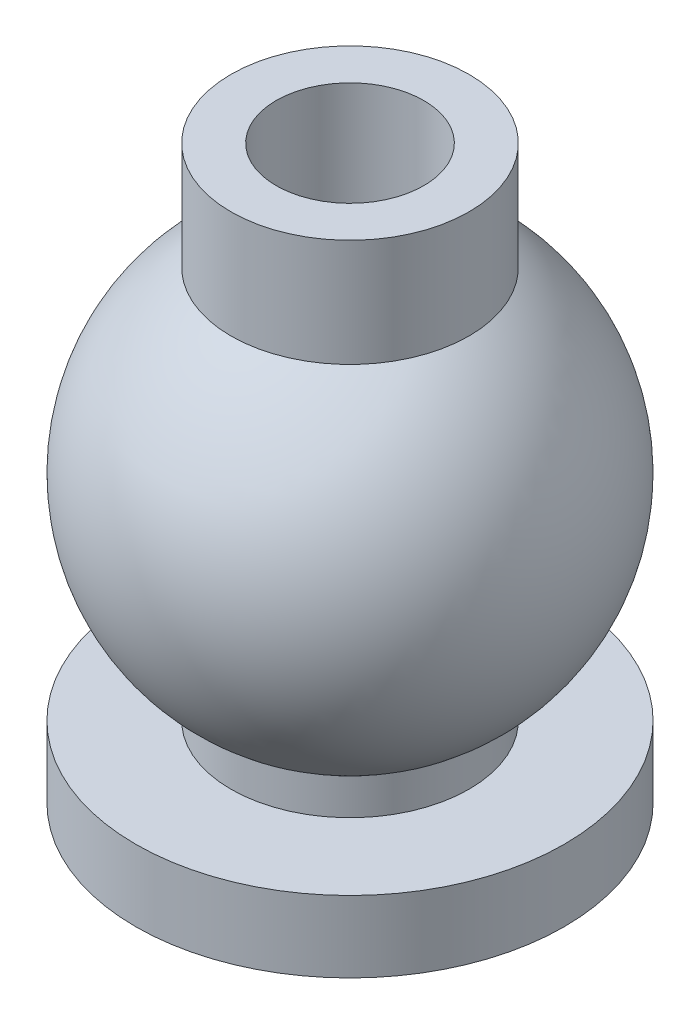
ISO-10303-21;
HEADER;
FILE_DESCRIPTION(('STEP AP214'),'2;1');
FILE_NAME('part.step','',(''),(''),'','','');
FILE_SCHEMA(('AUTOMOTIVE_DESIGN { 1 0 10303 214 1 1 1 1 }'));
ENDSEC;
DATA;
#1=APPLICATION_CONTEXT('core data for automotive mechanical design processes');
#2=APPLICATION_PROTOCOL_DEFINITION('international standard','automotive_design',2000,#1);
#3=PRODUCT_CONTEXT('',#1,'mechanical');
#4=PRODUCT('Part','Part','',(#3));
#5=PRODUCT_RELATED_PRODUCT_CATEGORY('part','',(#4));
#6=PRODUCT_DEFINITION_FORMATION('','',#4);
#7=PRODUCT_DEFINITION_CONTEXT('part definition',#1,'design');
#8=PRODUCT_DEFINITION('design','',#6,#7);
#9=PRODUCT_DEFINITION_SHAPE('','',#8);
#10=(LENGTH_UNIT() NAMED_UNIT(*) SI_UNIT(.MILLI.,.METRE.));
#11=(NAMED_UNIT(*) PLANE_ANGLE_UNIT() SI_UNIT($,.RADIAN.));
#12=(NAMED_UNIT(*) SI_UNIT($,.STERADIAN.) SOLID_ANGLE_UNIT());
#13=UNCERTAINTY_MEASURE_WITH_UNIT(LENGTH_MEASURE(1.E-05),#10,'distance_accuracy_value','');
#14=(GEOMETRIC_REPRESENTATION_CONTEXT(3) GLOBAL_UNCERTAINTY_ASSIGNED_CONTEXT((#13)) GLOBAL_UNIT_ASSIGNED_CONTEXT((#10,
#11,#12)) REPRESENTATION_CONTEXT('',''));
#15=CARTESIAN_POINT('',(0.,0.,0.));
#16=DIRECTION('',(0.,0.,1.));
#17=DIRECTION('',(1.,0.,0.));
#18=AXIS2_PLACEMENT_3D('',#15,#16,#17);
#19=CARTESIAN_POINT('',(0.,6.83647591011085,0.));
#20=DIRECTION('',(0.,1.,0.));
#21=DIRECTION('',(-1.,0.,0.));
#22=AXIS2_PLACEMENT_3D('',#19,#20,#21);
#23=CYLINDRICAL_SURFACE('',#22,1.55);
#24=CARTESIAN_POINT('',(0.,-6.,0.));
#25=DIRECTION('',(0.,1.,0.));
#26=DIRECTION('',(-1.,0.,0.));
#27=AXIS2_PLACEMENT_3D('',#24,#25,#26);
#28=CIRCLE('',#27,1.55);
#29=CARTESIAN_POINT('',(-1.55,-6.,0.));
#30=VERTEX_POINT('',#29);
#31=EDGE_CURVE('E10',#30,#30,#28,.T.);
#32=ORIENTED_EDGE('',*,*,#31,.F.);
#33=EDGE_LOOP('',(#32));
#34=FACE_BOUND('',#33,.T.);
#35=CARTESIAN_POINT('',(0.,6.,0.));
#36=DIRECTION('',(0.,1.,0.));
#37=DIRECTION('',(-1.,0.,0.));
#38=AXIS2_PLACEMENT_3D('',#35,#36,#37);
#39=CIRCLE('',#38,1.55);
#40=CARTESIAN_POINT('',(-1.55,6.,0.));
#41=VERTEX_POINT('',#40);
#42=EDGE_CURVE('E58',#41,#41,#39,.T.);
#43=ORIENTED_EDGE('',*,*,#42,.T.);
#44=EDGE_LOOP('',(#43));
#45=FACE_BOUND('',#44,.T.);
#46=ADVANCED_FACE('F30',(#34,#45),#23,.F.);
#47=CARTESIAN_POINT('',(1.55,-6.,0.));
#48=DIRECTION('',(0.,1.,0.));
#49=DIRECTION('',(-1.,0.,0.));
#50=AXIS2_PLACEMENT_3D('',#47,#48,#49);
#51=PLANE('',#50);
#52=CARTESIAN_POINT('',(0.,-6.,0.));
#53=DIRECTION('',(0.,1.,0.));
#54=DIRECTION('',(-1.,0.,0.));
#55=AXIS2_PLACEMENT_3D('',#52,#53,#54);
#56=CIRCLE('',#55,4.5);
#57=CARTESIAN_POINT('',(-4.5,-6.,0.));
#58=VERTEX_POINT('',#57);
#59=EDGE_CURVE('E36',#58,#58,#56,.T.);
#60=ORIENTED_EDGE('',*,*,#59,.F.);
#61=EDGE_LOOP('',(#60));
#62=FACE_BOUND('',#61,.T.);
#63=ORIENTED_EDGE('',*,*,#31,.T.);
#64=EDGE_LOOP('',(#63));
#65=FACE_BOUND('',#64,.T.);
#66=ADVANCED_FACE('F95',(#62,#65),#51,.F.);
#67=CARTESIAN_POINT('',(0.,6.83647591011085,0.));
#68=DIRECTION('',(0.,1.,0.));
#69=DIRECTION('',(-1.,0.,0.));
#70=AXIS2_PLACEMENT_3D('',#67,#68,#69);
#71=CYLINDRICAL_SURFACE('',#70,4.5);
#72=CARTESIAN_POINT('',(0.,-4.5,0.));
#73=DIRECTION('',(0.,1.,0.));
#74=DIRECTION('',(-1.,0.,0.));
#75=AXIS2_PLACEMENT_3D('',#72,#73,#74);
#76=CIRCLE('',#75,4.5);
#77=CARTESIAN_POINT('',(-4.5,-4.5,0.));
#78=VERTEX_POINT('',#77);
#79=EDGE_CURVE('E40',#78,#78,#76,.T.);
#80=ORIENTED_EDGE('',*,*,#79,.F.);
#81=EDGE_LOOP('',(#80));
#82=FACE_BOUND('',#81,.T.);
#83=ORIENTED_EDGE('',*,*,#59,.T.);
#84=EDGE_LOOP('',(#83));
#85=FACE_BOUND('',#84,.T.);
#86=ADVANCED_FACE('F90',(#82,#85),#71,.T.);
#87=CARTESIAN_POINT('',(4.5,-4.5,0.));
#88=DIRECTION('',(0.,-1.,0.));
#89=DIRECTION('',(1.,0.,0.));
#90=AXIS2_PLACEMENT_3D('',#87,#88,#89);
#91=PLANE('',#90);
#92=CARTESIAN_POINT('',(0.,-4.5,0.));
#93=DIRECTION('',(0.,1.,0.));
#94=DIRECTION('',(-1.,0.,0.));
#95=AXIS2_PLACEMENT_3D('',#92,#93,#94);
#96=CIRCLE('',#95,2.5);
#97=CARTESIAN_POINT('',(-2.5,-4.5,0.));
#98=VERTEX_POINT('',#97);
#99=EDGE_CURVE('E44',#98,#98,#96,.T.);
#100=ORIENTED_EDGE('',*,*,#99,.F.);
#101=EDGE_LOOP('',(#100));
#102=FACE_BOUND('',#101,.T.);
#103=ORIENTED_EDGE('',*,*,#79,.T.);
#104=EDGE_LOOP('',(#103));
#105=FACE_BOUND('',#104,.T.);
#106=ADVANCED_FACE('F84',(#102,#105),#91,.F.);
#107=CARTESIAN_POINT('',(0.,6.83647591011085,0.));
#108=DIRECTION('',(0.,1.,0.));
#109=DIRECTION('',(-1.,0.,0.));
#110=AXIS2_PLACEMENT_3D('',#107,#108,#109);
#111=CYLINDRICAL_SURFACE('',#110,2.5);
#112=CARTESIAN_POINT('',(0.,-3.74165738677394,0.));
#113=DIRECTION('',(0.,1.,0.));
#114=DIRECTION('',(-1.,0.,0.));
#115=AXIS2_PLACEMENT_3D('',#112,#113,#114);
#116=CIRCLE('',#115,2.5);
#117=CARTESIAN_POINT('',(2.5,-3.74165738677394,0.));
#118=VERTEX_POINT('',#117);
#119=EDGE_CURVE('E49',#118,#118,#116,.T.);
#120=ORIENTED_EDGE('',*,*,#119,.F.);
#121=EDGE_LOOP('',(#120));
#122=FACE_BOUND('',#121,.T.);
#123=ORIENTED_EDGE('',*,*,#99,.T.);
#124=EDGE_LOOP('',(#123));
#125=FACE_BOUND('',#124,.T.);
#126=ADVANCED_FACE('F78',(#122,#125),#111,.T.);
#127=CARTESIAN_POINT('',(0.,0.,0.));
#128=DIRECTION('',(0.,1.,0.));
#129=DIRECTION('',(1.,0.,0.));
#130=AXIS2_PLACEMENT_3D('',#127,#128,#129);
#131=SPHERICAL_SURFACE('',#130,4.5);
#132=CARTESIAN_POINT('',(0.,3.74165738677394,0.));
#133=DIRECTION('',(0.,1.,0.));
#134=DIRECTION('',(-1.,0.,0.));
#135=AXIS2_PLACEMENT_3D('',#132,#133,#134);
#136=CIRCLE('',#135,2.5);
#137=CARTESIAN_POINT('',(2.5,3.74165738677394,0.));
#138=VERTEX_POINT('',#137);
#139=EDGE_CURVE('E52',#138,#138,#136,.T.);
#140=CARTESIAN_POINT('',(2.5,3.74165738677394,0.));
#141=CARTESIAN_POINT('',(2.57653208912684,3.69052681710767,0.));
#142=CARTESIAN_POINT('',(2.65149089393866,3.6370423010449,0.));
#143=CARTESIAN_POINT('',(2.79798994477218,3.52558002520709,0.));
#144=CARTESIAN_POINT('',(2.86953019079389,3.46760226543205,0.));
#145=CARTESIAN_POINT('',(3.00892013388713,3.34736815125045,0.));
#146=CARTESIAN_POINT('',(3.07676983095866,3.28511179684389,0.));
#147=CARTESIAN_POINT('',(3.20852402462513,3.15655577832333,0.));
#148=CARTESIAN_POINT('',(3.27242852122007,3.09025611420933,0.));
#149=CARTESIAN_POINT('',(3.396051587965,2.95386276561121,0.));
#150=CARTESIAN_POINT('',(3.45577015811499,2.88376908112708,0.));
#151=CARTESIAN_POINT('',(3.57079664898672,2.74005158682958,0.));
#152=CARTESIAN_POINT('',(3.62610456970845,2.66642777701622,0.));
#153=CARTESIAN_POINT('',(3.73210157369841,2.51592712699503,0.));
#154=CARTESIAN_POINT('',(3.78279065696664,2.43905028678722,0.));
#155=CARTESIAN_POINT('',(3.87935920068286,2.28233293838332,0.));
#156=CARTESIAN_POINT('',(3.92523866113086,2.20249243018725,0.));
#157=CARTESIAN_POINT('',(4.01201527206291,2.04014825693203,0.));
#158=CARTESIAN_POINT('',(4.05291242254696,1.95764459187289,0.));
#159=CARTESIAN_POINT('',(4.1295704806472,1.79028464157529,0.));
#160=CARTESIAN_POINT('',(4.16533138826339,1.70542835633683,0.));
#161=CARTESIAN_POINT('',(4.2315823597355,1.53368255696441,0.));
#162=CARTESIAN_POINT('',(4.26207242359142,1.44679304283046,0.));
#163=CARTESIAN_POINT('',(4.31766694572109,1.27130782996089,0.));
#164=CARTESIAN_POINT('',(4.34277140399484,1.18271213122526,0.));
#165=CARTESIAN_POINT('',(4.38750022404583,1.00414801533831,0.));
#166=CARTESIAN_POINT('',(4.40712458582306,0.914179598186995,0.));
#167=CARTESIAN_POINT('',(4.44081934856051,0.733208678451207,0.));
#168=CARTESIAN_POINT('',(4.45488974952073,0.642206175866736,0.));
#169=CARTESIAN_POINT('',(4.47742363090783,0.459509610448848,0.));
#170=CARTESIAN_POINT('',(4.48588711133471,0.367815547615431,0.));
#171=CARTESIAN_POINT('',(4.4971752958808,0.184080989854676,0.));
#172=CARTESIAN_POINT('',(4.5,0.0920404949273381,0.));
#173=CARTESIAN_POINT('',(4.5,-0.092040494927338,0.));
#174=CARTESIAN_POINT('',(4.4971752958808,-0.184080989854676,0.));
#175=CARTESIAN_POINT('',(4.48588711133471,-0.367815547615431,0.));
#176=CARTESIAN_POINT('',(4.47742363090783,-0.459509610448847,0.));
#177=CARTESIAN_POINT('',(4.45488974952073,-0.642206175866736,0.));
#178=CARTESIAN_POINT('',(4.44081934856051,-0.733208678451208,0.));
#179=CARTESIAN_POINT('',(4.40712458582306,-0.914179598186995,0.));
#180=CARTESIAN_POINT('',(4.38750022404583,-1.00414801533831,0.));
#181=CARTESIAN_POINT('',(4.34277140399484,-1.18271213122526,0.));
#182=CARTESIAN_POINT('',(4.31766694572109,-1.27130782996088,0.));
#183=CARTESIAN_POINT('',(4.26207242359142,-1.44679304283046,0.));
#184=CARTESIAN_POINT('',(4.2315823597355,-1.53368255696441,0.));
#185=CARTESIAN_POINT('',(4.16533138826339,-1.70542835633683,0.));
#186=CARTESIAN_POINT('',(4.1295704806472,-1.79028464157529,0.));
#187=CARTESIAN_POINT('',(4.05291242254695,-1.95764459187289,0.));
#188=CARTESIAN_POINT('',(4.01201527206291,-2.04014825693203,0.));
#189=CARTESIAN_POINT('',(3.92523866113086,-2.20249243018725,0.));
#190=CARTESIAN_POINT('',(3.87935920068286,-2.28233293838332,0.));
#191=CARTESIAN_POINT('',(3.78279065696664,-2.43905028678722,0.));
#192=CARTESIAN_POINT('',(3.73210157369841,-2.51592712699503,0.));
#193=CARTESIAN_POINT('',(3.62610456970846,-2.66642777701622,0.));
#194=CARTESIAN_POINT('',(3.57079664898672,-2.74005158682958,0.));
#195=CARTESIAN_POINT('',(3.45577015811499,-2.88376908112708,0.));
#196=CARTESIAN_POINT('',(3.396051587965,-2.95386276561121,0.));
#197=CARTESIAN_POINT('',(3.27242852122007,-3.09025611420933,0.));
#198=CARTESIAN_POINT('',(3.20852402462513,-3.15655577832333,0.));
#199=CARTESIAN_POINT('',(3.07676983095866,-3.28511179684389,0.));
#200=CARTESIAN_POINT('',(3.00892013388713,-3.34736815125045,0.));
#201=CARTESIAN_POINT('',(2.86953019079389,-3.46760226543205,0.));
#202=CARTESIAN_POINT('',(2.79798994477218,-3.52558002520709,0.));
#203=CARTESIAN_POINT('',(2.65149089393866,-3.6370423010449,0.));
#204=CARTESIAN_POINT('',(2.57653208912684,-3.69052681710767,0.));
#205=CARTESIAN_POINT('',(2.5,-3.74165738677394,0.));
#206=B_SPLINE_CURVE_WITH_KNOTS('',3,(#140,#141,#142,#143,#144,#145,#146,#147,#148,#149,#150,
#151,#152,#153,#154,#155,#156,#157,#158,#159,#160,#161,#162,#163,#164,#165,#166,#167,#168,#169,
#170,#171,#172,#173,#174,#175,#176,#177,#178,#179,#180,#181,#182,#183,#184,#185,#186,#187,#188,
#189,#190,#191,#192,#193,#194,#195,#196,#197,#198,#199,#200,#201,#202,#203,#204,#205),
.UNSPECIFIED.,.F.,.F.,(4,2,2,2,2,2,2,2,2,2,2,2,2,2,2,2,2,2,2,2,2,2,2,2,2,2,2,2,2,2,2,2,4),(0.,
0.276078190971699,0.5521563819434,0.828234572915101,1.1043127638868,1.3803909548585,
1.6564691458302,1.9325473368019,2.2086255277736,2.4847037187453,2.760781909717,3.0368601006887,
3.3129382916604,3.5890164826321,3.8650946736038,4.1411728645755,4.4172510555472,4.6933292465189,
4.96940743749061,5.24548562846231,5.52156381943401,5.79764201040571,6.07372020137741,
6.34979839234911,6.62587658332081,6.90195477429251,7.17803296526421,7.45411115623591,
7.73018934720761,8.00626753817931,8.28234572915101,8.55842392012271,8.83450211109441),.UNSPECIFIED.);
#207=EDGE_CURVE('BSEAM72',#138,#118,#206,.T.);
#208=ORIENTED_EDGE('',*,*,#139,.F.);
#209=ORIENTED_EDGE('',*,*,#119,.T.);
#210=ORIENTED_EDGE('',*,*,#207,.T.);
#211=ORIENTED_EDGE('',*,*,#207,.F.);
#212=EDGE_LOOP('',(#208,#210,#209,#211));
#213=FACE_BOUND('',#212,.T.);
#214=ADVANCED_FACE('F72',(#213),#131,.T.);
#215=CARTESIAN_POINT('',(0.,6.83647591011085,0.));
#216=DIRECTION('',(0.,1.,0.));
#217=DIRECTION('',(-1.,0.,0.));
#218=AXIS2_PLACEMENT_3D('',#215,#216,#217);
#219=CYLINDRICAL_SURFACE('',#218,2.5);
#220=CARTESIAN_POINT('',(0.,6.,0.));
#221=DIRECTION('',(0.,1.,0.));
#222=DIRECTION('',(-1.,0.,0.));
#223=AXIS2_PLACEMENT_3D('',#220,#221,#222);
#224=CIRCLE('',#223,2.5);
#225=CARTESIAN_POINT('',(-2.5,6.,0.));
#226=VERTEX_POINT('',#225);
#227=EDGE_CURVE('E55',#226,#226,#224,.T.);
#228=ORIENTED_EDGE('',*,*,#227,.F.);
#229=EDGE_LOOP('',(#228));
#230=FACE_BOUND('',#229,.T.);
#231=ORIENTED_EDGE('',*,*,#139,.T.);
#232=EDGE_LOOP('',(#231));
#233=FACE_BOUND('',#232,.T.);
#234=ADVANCED_FACE('F66',(#230,#233),#219,.T.);
#235=CARTESIAN_POINT('',(1.55,6.,0.));
#236=DIRECTION('',(0.,-1.,0.));
#237=DIRECTION('',(1.,0.,0.));
#238=AXIS2_PLACEMENT_3D('',#235,#236,#237);
#239=PLANE('',#238);
#240=ORIENTED_EDGE('',*,*,#42,.F.);
#241=EDGE_LOOP('',(#240));
#242=FACE_BOUND('',#241,.T.);
#243=ORIENTED_EDGE('',*,*,#227,.T.);
#244=EDGE_LOOP('',(#243));
#245=FACE_BOUND('',#244,.T.);
#246=ADVANCED_FACE('F63',(#242,#245),#239,.F.);
#247=CLOSED_SHELL('',(#46,#66,#86,#106,#126,#214,#234,#246));
#248=MANIFOLD_SOLID_BREP('B2',#247);
#249=ADVANCED_BREP_SHAPE_REPRESENTATION('',(#18,#248),#14);
#250=SHAPE_DEFINITION_REPRESENTATION(#9,#249);
ENDSEC;
END-ISO-10303-21;
